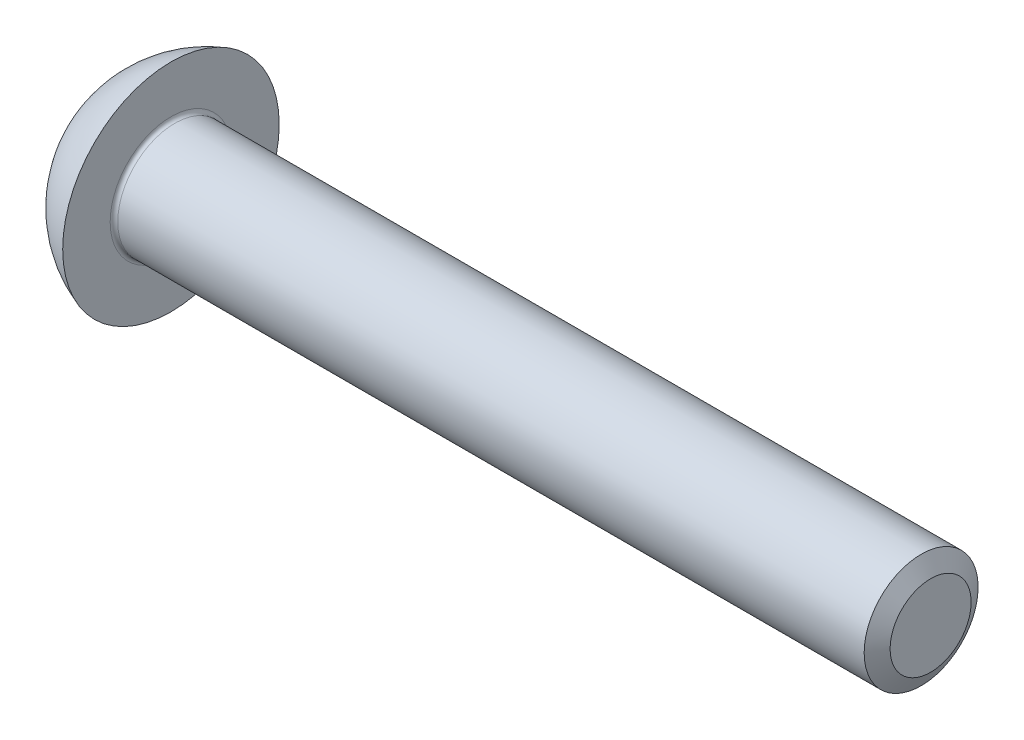
ISO-10303-21;
HEADER;
FILE_DESCRIPTION(('STEP AP214'),'2;1');
FILE_NAME('part.step','',(''),(''),'','','');
FILE_SCHEMA(('AUTOMOTIVE_DESIGN { 1 0 10303 214 1 1 1 1 }'));
ENDSEC;
DATA;
#1=APPLICATION_CONTEXT('core data for automotive mechanical design processes');
#2=APPLICATION_PROTOCOL_DEFINITION('international standard','automotive_design',2000,#1);
#3=PRODUCT_CONTEXT('',#1,'mechanical');
#4=PRODUCT('Part','Part','',(#3));
#5=PRODUCT_RELATED_PRODUCT_CATEGORY('part','',(#4));
#6=PRODUCT_DEFINITION_FORMATION('','',#4);
#7=PRODUCT_DEFINITION_CONTEXT('part definition',#1,'design');
#8=PRODUCT_DEFINITION('design','',#6,#7);
#9=PRODUCT_DEFINITION_SHAPE('','',#8);
#10=(LENGTH_UNIT() NAMED_UNIT(*) SI_UNIT(.MILLI.,.METRE.));
#11=(NAMED_UNIT(*) PLANE_ANGLE_UNIT() SI_UNIT($,.RADIAN.));
#12=(NAMED_UNIT(*) SI_UNIT($,.STERADIAN.) SOLID_ANGLE_UNIT());
#13=UNCERTAINTY_MEASURE_WITH_UNIT(LENGTH_MEASURE(1.E-05),#10,'distance_accuracy_value','');
#14=(GEOMETRIC_REPRESENTATION_CONTEXT(3) GLOBAL_UNCERTAINTY_ASSIGNED_CONTEXT((#13)) GLOBAL_UNIT_ASSIGNED_CONTEXT((#10,
#11,#12)) REPRESENTATION_CONTEXT('',''));
#15=CARTESIAN_POINT('',(0.,0.,0.));
#16=DIRECTION('',(0.,0.,1.));
#17=DIRECTION('',(1.,0.,0.));
#18=AXIS2_PLACEMENT_3D('',#15,#16,#17);
#19=CARTESIAN_POINT('',(-21.65,0.,0.));
#20=DIRECTION('',(-1.,0.,0.));
#21=DIRECTION('',(0.,0.,1.));
#22=AXIS2_PLACEMENT_3D('',#19,#20,#21);
#23=CYLINDRICAL_SURFACE('',#22,1.5);
#24=CARTESIAN_POINT('',(-19.9,0.,0.));
#25=DIRECTION('',(-1.,0.,0.));
#26=DIRECTION('',(0.,0.,1.));
#27=AXIS2_PLACEMENT_3D('',#24,#25,#26);
#28=CIRCLE('',#27,1.5);
#29=CARTESIAN_POINT('',(-19.9,0.,1.5));
#30=VERTEX_POINT('',#29);
#31=EDGE_CURVE('E264',#30,#30,#28,.T.);
#32=ORIENTED_EDGE('',*,*,#31,.F.);
#33=EDGE_LOOP('',(#32));
#34=FACE_BOUND('',#33,.T.);
#35=CARTESIAN_POINT('',(-0.25,0.,0.));
#36=DIRECTION('',(-1.,0.,0.));
#37=DIRECTION('',(0.,0.,1.));
#38=AXIS2_PLACEMENT_3D('',#35,#36,#37);
#39=CIRCLE('',#38,1.5);
#40=CARTESIAN_POINT('',(-0.25,0.,1.5));
#41=VERTEX_POINT('',#40);
#42=EDGE_CURVE('E448',#41,#41,#39,.T.);
#43=ORIENTED_EDGE('',*,*,#42,.T.);
#44=EDGE_LOOP('',(#43));
#45=FACE_BOUND('',#44,.T.);
#46=ADVANCED_FACE('F42',(#34,#45),#23,.T.);
#47=CARTESIAN_POINT('',(-21.65,0.,0.));
#48=DIRECTION('',(1.,0.,0.));
#49=DIRECTION('',(0.,0.,-1.));
#50=AXIS2_PLACEMENT_3D('',#47,#48,#49);
#51=PLANE('',#50);
#52=CARTESIAN_POINT('',(-21.65,0.,0.));
#53=DIRECTION('',(-1.,0.,0.));
#54=DIRECTION('',(0.,0.,1.));
#55=AXIS2_PLACEMENT_3D('',#52,#53,#54);
#56=CIRCLE('',#55,1.5);
#57=CARTESIAN_POINT('',(-21.65,1.5,0.));
#58=VERTEX_POINT('',#57);
#59=EDGE_CURVE('E256',#58,#58,#56,.T.);
#60=ORIENTED_EDGE('',*,*,#59,.T.);
#61=EDGE_LOOP('',(#60));
#62=FACE_BOUND('',#61,.T.);
#63=CARTESIAN_POINT('',(-21.65,0.,0.));
#64=DIRECTION('',(1.,0.,0.));
#65=DIRECTION('',(0.,0.,-1.));
#66=AXIS2_PLACEMENT_3D('',#63,#64,#65);
#67=CIRCLE('',#66,1.15470053837925);
#68=CARTESIAN_POINT('',(-21.65,-0.577350269189627,-1.));
#69=VERTEX_POINT('',#68);
#70=CARTESIAN_POINT('',(-21.65,-1.15470053837925,0.));
#71=VERTEX_POINT('',#70);
#72=EDGE_CURVE('E11',#69,#71,#67,.F.);
#73=ORIENTED_EDGE('',*,*,#72,.F.);
#74=CARTESIAN_POINT('',(-21.65,0.577350269189628,-1.));
#75=VERTEX_POINT('',#74);
#76=EDGE_CURVE('E46',#75,#69,#67,.F.);
#77=ORIENTED_EDGE('',*,*,#76,.F.);
#78=CARTESIAN_POINT('',(-21.65,1.15470053837925,0.));
#79=VERTEX_POINT('',#78);
#80=EDGE_CURVE('E115',#79,#75,#67,.F.);
#81=ORIENTED_EDGE('',*,*,#80,.F.);
#82=CARTESIAN_POINT('',(-21.65,0.,0.));
#83=DIRECTION('',(-1.,0.,0.));
#84=DIRECTION('',(0.,0.,1.));
#85=AXIS2_PLACEMENT_3D('',#82,#83,#84);
#86=CIRCLE('',#85,1.15470053837925);
#87=CARTESIAN_POINT('',(-21.65,0.577350269189629,1.));
#88=VERTEX_POINT('',#87);
#89=EDGE_CURVE('E135',#88,#79,#86,.T.);
#90=ORIENTED_EDGE('',*,*,#89,.F.);
#91=CARTESIAN_POINT('',(-21.65,-0.577350269189633,0.999999999999999));
#92=VERTEX_POINT('',#91);
#93=EDGE_CURVE('E330',#92,#88,#67,.F.);
#94=ORIENTED_EDGE('',*,*,#93,.F.);
#95=EDGE_CURVE('E51',#71,#92,#67,.F.);
#96=ORIENTED_EDGE('',*,*,#95,.F.);
#97=EDGE_LOOP('',(#73,#77,#81,#90,#94,#96));
#98=FACE_BOUND('',#97,.T.);
#99=ADVANCED_FACE('F44',(#62,#98),#51,.F.);
#100=CARTESIAN_POINT('',(-19.0454545454545,0.,0.));
#101=DIRECTION('',(-1.,0.,0.));
#102=DIRECTION('',(0.,1.,0.));
#103=AXIS2_PLACEMENT_3D('',#100,#101,#102);
#104=SPHERICAL_SURFACE('',#103,3.00560426949281);
#105=CARTESIAN_POINT('',(-20.,0.,0.));
#106=DIRECTION('',(-1.,0.,0.));
#107=DIRECTION('',(0.,0.,1.));
#108=AXIS2_PLACEMENT_3D('',#105,#106,#107);
#109=CIRCLE('',#108,2.85);
#110=CARTESIAN_POINT('',(-20.,2.85,0.));
#111=VERTEX_POINT('',#110);
#112=EDGE_CURVE('E259',#111,#111,#109,.T.);
#113=CARTESIAN_POINT('',(-21.65,1.5,0.));
#114=CARTESIAN_POINT('',(-21.6386705331495,1.51967216925548,0.));
#115=CARTESIAN_POINT('',(-21.6271181108235,1.53921593268644,0.));
#116=CARTESIAN_POINT('',(-21.6035734644196,1.57803672196104,0.));
#117=CARTESIAN_POINT('',(-21.5915812403415,1.59731374780469,0.));
#118=CARTESIAN_POINT('',(-21.5671630996322,1.6355911359664,0.));
#119=CARTESIAN_POINT('',(-21.554737183001,1.65459149828447,0.));
#120=CARTESIAN_POINT('',(-21.5294580495481,1.69230581219272,0.));
#121=CARTESIAN_POINT('',(-21.5166048327265,1.7110197637829,0.));
#122=CARTESIAN_POINT('',(-21.4904776944242,1.74815164624667,0.));
#123=CARTESIAN_POINT('',(-21.4772037729434,1.76656957712027,0.));
#124=CARTESIAN_POINT('',(-21.4502420411911,1.80309996277641,0.));
#125=CARTESIAN_POINT('',(-21.4365542309196,1.82121241755895,0.));
#126=CARTESIAN_POINT('',(-21.4087717487848,1.85712255178676,0.));
#127=CARTESIAN_POINT('',(-21.3946770769215,1.87492023123203,0.));
#128=CARTESIAN_POINT('',(-21.366088108,1.91019167733672,0.));
#129=CARTESIAN_POINT('',(-21.3515938109419,1.92766544399614,0.));
#130=CARTESIAN_POINT('',(-21.3222130331156,1.96228009332959,0.));
#131=CARTESIAN_POINT('',(-21.3073265523475,1.97942097600363,0.));
#132=CARTESIAN_POINT('',(-21.2771690499588,2.013361057086,0.));
#133=CARTESIAN_POINT('',(-21.2618980283382,2.03016025549433,0.));
#134=CARTESIAN_POINT('',(-21.2309792845233,2.06340834318511,0.));
#135=CARTESIAN_POINT('',(-21.2153315623289,2.07985723246756,0.));
#136=CARTESIAN_POINT('',(-21.1836674510477,2.11239625689921,0.));
#137=CARTESIAN_POINT('',(-21.1676510619609,2.12848639204841,0.));
#138=CARTESIAN_POINT('',(-21.1352578398529,2.16029964739355,0.));
#139=CARTESIAN_POINT('',(-21.1188810068317,2.17602276758948,0.));
#140=CARTESIAN_POINT('',(-21.0857753048683,2.2070939206369,0.));
#141=CARTESIAN_POINT('',(-21.069046435926,2.22244195348839,0.));
#142=CARTESIAN_POINT('',(-21.0352452508718,2.25275505202893,0.));
#143=CARTESIAN_POINT('',(-21.01817293476,2.26772011771799,0.));
#144=CARTESIAN_POINT('',(-20.9836936204474,2.29725959873447,0.));
#145=CARTESIAN_POINT('',(-20.9662866222466,2.3118340140619,0.));
#146=CARTESIAN_POINT('',(-20.9311468806653,2.34058471171934,0.));
#147=CARTESIAN_POINT('',(-20.9134141372848,2.35476099404935,0.));
#148=CARTESIAN_POINT('',(-20.8776320094939,2.38270814748122,0.));
#149=CARTESIAN_POINT('',(-20.8595826250834,2.39647901858308,0.));
#150=CARTESIAN_POINT('',(-20.8231764819488,2.42360827946968,0.));
#151=CARTESIAN_POINT('',(-20.8048197232246,2.43696666925441,0.));
#152=CARTESIAN_POINT('',(-20.7678082559874,2.46326410918943,0.));
#153=CARTESIAN_POINT('',(-20.7491535474743,2.4762031593397,0.));
#154=CARTESIAN_POINT('',(-20.7115557581542,2.50165527698115,0.));
#155=CARTESIAN_POINT('',(-20.6926126773472,2.51416834447232,0.));
#156=CARTESIAN_POINT('',(-20.6544478689872,2.53876207247436,0.));
#157=CARTESIAN_POINT('',(-20.6352261414343,2.55084273298524,0.));
#158=CARTESIAN_POINT('',(-20.5965139081898,2.57456544470666,0.));
#159=CARTESIAN_POINT('',(-20.5770234024984,2.5862074959172,0.));
#160=CARTESIAN_POINT('',(-20.5377836195783,2.60904701190566,0.));
#161=CARTESIAN_POINT('',(-20.5180343423497,2.62024447668356,0.));
#162=CARTESIAN_POINT('',(-20.4782871558097,2.6421890709225,0.));
#163=CARTESIAN_POINT('',(-20.4582892464984,2.65293620038353,0.));
#164=CARTESIAN_POINT('',(-20.4180550629064,2.67397460633529,0.));
#165=CARTESIAN_POINT('',(-20.3978187886257,2.68426588282604,0.));
#166=CARTESIAN_POINT('',(-20.3571182645539,2.70438729913089,0.));
#167=CARTESIAN_POINT('',(-20.3366540147628,2.714217438945,0.));
#168=CARTESIAN_POINT('',(-20.2955080462974,2.73341153528513,0.));
#169=CARTESIAN_POINT('',(-20.2748263276231,2.74277549181114,0.));
#170=CARTESIAN_POINT('',(-20.2332560392077,2.7610324130256,0.));
#171=CARTESIAN_POINT('',(-20.2123674694665,2.76992537771405,0.));
#172=CARTESIAN_POINT('',(-20.1703942046549,2.78723575329491,0.));
#173=CARTESIAN_POINT('',(-20.1493095095844,2.79565316418733,0.));
#174=CARTESIAN_POINT('',(-20.1069548141172,2.81200809653372,0.));
#175=CARTESIAN_POINT('',(-20.0856848137203,2.8199456179877,0.));
#176=CARTESIAN_POINT('',(-20.0429704467276,2.83533674876495,0.));
#177=CARTESIAN_POINT('',(-20.0215260801317,2.84279035808822,0.));
#178=CARTESIAN_POINT('',(-20.,2.85,0.));
#179=B_SPLINE_CURVE_WITH_KNOTS('',3,(#113,#114,#115,#116,#117,#118,#119,#120,#121,#122,#123,
#124,#125,#126,#127,#128,#129,#130,#131,#132,#133,#134,#135,#136,#137,#138,#139,#140,#141,#142,
#143,#144,#145,#146,#147,#148,#149,#150,#151,#152,#153,#154,#155,#156,#157,#158,#159,#160,#161,
#162,#163,#164,#165,#166,#167,#168,#169,#170,#171,#172,#173,#174,#175,#176,#177,#178),
.UNSPECIFIED.,.F.,.F.,(4,2,2,2,2,2,2,2,2,2,2,2,2,2,2,2,2,2,2,2,2,2,2,2,2,2,2,2,2,2,2,2,4),(0.,
0.0681025747754097,0.13620514955082,0.204307724326229,0.272410299101638,0.340512873877049,
0.408615448652458,0.476718023427868,0.544820598203277,0.612923172978687,0.681025747754097,
0.749128322529505,0.817230897304915,0.885333472080326,0.953436046855734,1.02153862163114,
1.08964119640655,1.15774377118196,1.22584634595737,1.29394892073278,1.36205149550819,
1.4301540702836,1.49825664505901,1.56635921983442,1.63446179460983,1.70256436938524,
1.77066694416065,1.83876951893606,1.90687209371147,1.97497466848688,2.04307724326229,
2.1111798180377,2.17928239281311),.UNSPECIFIED.);
#180=EDGE_CURVE('BSEAM244',#58,#111,#179,.T.);
#181=ORIENTED_EDGE('',*,*,#59,.F.);
#182=ORIENTED_EDGE('',*,*,#112,.T.);
#183=ORIENTED_EDGE('',*,*,#180,.T.);
#184=ORIENTED_EDGE('',*,*,#180,.F.);
#185=EDGE_LOOP('',(#181,#183,#182,#184));
#186=FACE_BOUND('',#185,.T.);
#187=ADVANCED_FACE('F244',(#186),#104,.T.);
#188=CARTESIAN_POINT('',(-20.,1.6,0.));
#189=DIRECTION('',(-1.,0.,0.));
#190=DIRECTION('',(0.,0.,1.));
#191=AXIS2_PLACEMENT_3D('',#188,#189,#190);
#192=PLANE('',#191);
#193=ORIENTED_EDGE('',*,*,#112,.F.);
#194=EDGE_LOOP('',(#193));
#195=FACE_BOUND('',#194,.T.);
#196=CARTESIAN_POINT('',(-20.,0.,0.));
#197=DIRECTION('',(-1.,0.,0.));
#198=DIRECTION('',(0.,0.,1.));
#199=AXIS2_PLACEMENT_3D('',#196,#197,#198);
#200=CIRCLE('',#199,1.6);
#201=CARTESIAN_POINT('',(-20.,0.,1.6));
#202=VERTEX_POINT('',#201);
#203=EDGE_CURVE('E260',#202,#202,#200,.T.);
#204=ORIENTED_EDGE('',*,*,#203,.T.);
#205=EDGE_LOOP('',(#204));
#206=FACE_BOUND('',#205,.T.);
#207=ADVANCED_FACE('F241',(#195,#206),#192,.F.);
#208=CARTESIAN_POINT('',(-19.9,0.,0.));
#209=DIRECTION('',(-1.,0.,0.));
#210=DIRECTION('',(0.,0.,1.));
#211=AXIS2_PLACEMENT_3D('',#208,#209,#210);
#212=TOROIDAL_SURFACE('',#211,1.6,0.100000000000001);
#213=ORIENTED_EDGE('',*,*,#203,.F.);
#214=EDGE_LOOP('',(#213));
#215=FACE_BOUND('',#214,.T.);
#216=ORIENTED_EDGE('',*,*,#31,.T.);
#217=EDGE_LOOP('',(#216));
#218=FACE_BOUND('',#217,.T.);
#219=ADVANCED_FACE('F238',(#215,#218),#212,.F.);
#220=CARTESIAN_POINT('',(-21.35,0.,0.));
#221=DIRECTION('',(-1.,0.,0.));
#222=DIRECTION('',(0.,0.,1.));
#223=AXIS2_PLACEMENT_3D('',#220,#221,#222);
#224=CONICAL_SURFACE('',#223,0.,1.31660847419538);
#225=CARTESIAN_POINT('',(-21.8201338061757,-1.5081300450323,-1.));
#226=CARTESIAN_POINT('',(-21.8103550434582,-1.46296169551438,-1.));
#227=CARTESIAN_POINT('',(-21.8007010634319,-1.41776633015547,-1.));
#228=CARTESIAN_POINT('',(-21.7817057249496,-1.32730802004725,-1.));
#229=CARTESIAN_POINT('',(-21.7723643798043,-1.28204507250605,-1.));
#230=CARTESIAN_POINT('',(-21.744887707109,-1.1460540932135,-1.));
#231=CARTESIAN_POINT('',(-21.727318593487,-1.05520983554783,-1.));
#232=CARTESIAN_POINT('',(-21.6946113120355,-0.873838301527069,-1.));
#233=CARTESIAN_POINT('',(-21.6794545669183,-0.783314439111169,-1.));
#234=CARTESIAN_POINT('',(-21.6526000869216,-0.601754544937858,-1.));
#235=CARTESIAN_POINT('',(-21.6409016960468,-0.510718613654571,-1.));
#236=CARTESIAN_POINT('',(-21.6224688104588,-0.32714728936339,-1.));
#237=CARTESIAN_POINT('',(-21.615787761882,-0.234606191530869,-1.));
#238=CARTESIAN_POINT('',(-21.6090368362792,-0.0493046546038942,-1.));
#239=CARTESIAN_POINT('',(-21.6089640024594,0.04345566782023,-1.));
#240=CARTESIAN_POINT('',(-21.6154534933963,0.229083736297403,-1.));
#241=CARTESIAN_POINT('',(-21.6220414736928,0.321950510989406,-1.));
#242=CARTESIAN_POINT('',(-21.6404572139866,0.507192547661315,-1.));
#243=CARTESIAN_POINT('',(-21.6522884816114,0.59956743864776,-1.));
#244=CARTESIAN_POINT('',(-21.6798118313046,0.785811374344468,-1.));
#245=CARTESIAN_POINT('',(-21.6955836030667,0.879668210998819,-1.));
#246=CARTESIAN_POINT('',(-21.7295232966728,1.06695285350417,-1.));
#247=CARTESIAN_POINT('',(-21.7476915787193,1.16038059267177,-1.));
#248=CARTESIAN_POINT('',(-21.7855853163011,1.34694314919725,-1.));
#249=CARTESIAN_POINT('',(-21.8053112029702,1.44007787798178,-1.));
#250=CARTESIAN_POINT('',(-21.8457971322914,1.62612272763755,-1.));
#251=CARTESIAN_POINT('',(-21.866557196056,1.71903284388273,-1.));
#252=CARTESIAN_POINT('',(-21.9085485742601,1.90363742744431,-1.));
#253=CARTESIAN_POINT('',(-21.9297718689088,1.99533372655925,-1.));
#254=CARTESIAN_POINT('',(-21.9727143057913,2.17861191601366,-1.));
#255=CARTESIAN_POINT('',(-21.9944334585808,2.27019380387373,-1.));
#256=CARTESIAN_POINT('',(-22.0382042420233,2.45314970796373,-1.));
#257=CARTESIAN_POINT('',(-22.0602553943374,2.54452383886908,-1.));
#258=CARTESIAN_POINT('',(-22.1046332471854,2.72720190599483,-1.));
#259=CARTESIAN_POINT('',(-22.1269599382911,2.81850584450411,-1.));
#260=CARTESIAN_POINT('',(-22.1493826695211,2.9097859214388,-1.));
#261=B_SPLINE_CURVE_WITH_KNOTS('',3,(#225,#226,#227,#228,#229,#230,#231,#232,#233,#234,#235,
#236,#237,#238,#239,#240,#241,#242,#243,#244,#245,#246,#247,#248,#249,#250,#251,#252,#253,#254,
#255,#256,#257,#258,#259,#260),.UNSPECIFIED.,.F.,.F.,(4,2,2,2,2,2,2,2,2,2,2,2,2,2,2,2,2,4),(0.,
0.138643869889782,0.277293635233151,0.554857004517541,0.830167022781704,1.10542478551794,
1.38357462934897,1.66160001660695,1.94070037269331,2.21998772241579,2.50545939030144,
2.79097401441239,3.07656794584651,3.36216771000261,3.64452690710852,3.92689212062334,
4.20888343548738,4.49086512790397),.UNSPECIFIED.);
#262=EDGE_CURVE('E106',#69,#75,#261,.T.);
#263=ORIENTED_EDGE('',*,*,#262,.T.);
#264=ORIENTED_EDGE('',*,*,#76,.T.);
#265=EDGE_LOOP('',(#263,#264));
#266=FACE_BOUND('',#265,.T.);
#267=ADVANCED_FACE('F110',(#266),#224,.F.);
#268=CARTESIAN_POINT('',(-21.6500300044995,0.57723479913579,-1.0002));
#269=CARTESIAN_POINT('',(-21.6437929192042,0.601225021738601,-0.958647715567044));
#270=CARTESIAN_POINT('',(-21.6381313786167,0.625256195021443,-0.917024502475672));
#271=CARTESIAN_POINT('',(-21.6281854217223,0.673398386330441,-0.833639781140785));
#272=CARTESIAN_POINT('',(-21.6239015302713,0.697509431260086,-0.791878226299065));
#273=CARTESIAN_POINT('',(-21.6169589031667,0.745673772514857,-0.708455140132715));
#274=CARTESIAN_POINT('',(-21.6142923745456,0.769726780462719,-0.66679410829216));
#275=CARTESIAN_POINT('',(-21.6107168929941,0.817861664223351,-0.583422044002323));
#276=CARTESIAN_POINT('',(-21.6098076211353,0.841943534003896,-0.541711022001162));
#277=CARTESIAN_POINT('',(-21.6098076211353,0.890107273564986,-0.458288977998839));
#278=CARTESIAN_POINT('',(-21.6107168929941,0.914189143345531,-0.416577955997678));
#279=CARTESIAN_POINT('',(-21.6142923745456,0.962324027106163,-0.333205891707841));
#280=CARTESIAN_POINT('',(-21.6169589031667,0.986377035054025,-0.291544859867286));
#281=CARTESIAN_POINT('',(-21.6239015302713,1.0345413763088,-0.208121773700937));
#282=CARTESIAN_POINT('',(-21.6281854217223,1.05865242123844,-0.166360218859217));
#283=CARTESIAN_POINT('',(-21.6381313786167,1.10679461254744,-0.0829754975243298));
#284=CARTESIAN_POINT('',(-21.6437929192042,1.13082578583028,-0.041352284432957));
#285=CARTESIAN_POINT('',(-21.6500300044996,1.15481600843309,0.000199999999998983));
#286=B_SPLINE_CURVE_WITH_KNOTS('',3,(#268,#269,#270,#271,#272,#273,#274,#275,#276,#277,#278,
#279,#280,#281,#282,#283,#284,#285),.UNSPECIFIED.,.F.,.F.,(4,2,2,2,2,2,2,2,4),(0.,
0.145159524820138,0.290374287087485,0.434883682122849,0.57936684736763,0.723850012612412,
0.868359407647777,1.01357416991512,1.15873369473526),.UNSPECIFIED.);
#287=EDGE_CURVE('E133',#75,#79,#286,.T.);
#288=ORIENTED_EDGE('',*,*,#287,.T.);
#289=ORIENTED_EDGE('',*,*,#80,.T.);
#290=EDGE_LOOP('',(#288,#289));
#291=FACE_BOUND('',#290,.T.);
#292=ADVANCED_FACE('F162',(#291),#224,.F.);
#293=CARTESIAN_POINT('',(-21.6500300044996,1.15481600843309,-0.000200000000000797));
#294=CARTESIAN_POINT('',(-21.6437929192042,1.13082578583028,0.0413522844329553));
#295=CARTESIAN_POINT('',(-21.6381313786167,1.10679461254744,0.0829754975243281));
#296=CARTESIAN_POINT('',(-21.6281854217223,1.05865242123844,0.166360218859215));
#297=CARTESIAN_POINT('',(-21.6239015302713,1.0345413763088,0.208121773700935));
#298=CARTESIAN_POINT('',(-21.6169589031667,0.986377035054025,0.291544859867285));
#299=CARTESIAN_POINT('',(-21.6142923745456,0.962324027106163,0.33320589170784));
#300=CARTESIAN_POINT('',(-21.6107168929941,0.914189143345531,0.416577955997676));
#301=CARTESIAN_POINT('',(-21.6098076211353,0.890107273564986,0.458288977998838));
#302=CARTESIAN_POINT('',(-21.6098076211353,0.841943534003896,0.541711022001161));
#303=CARTESIAN_POINT('',(-21.6107168929941,0.817861664223351,0.583422044002322));
#304=CARTESIAN_POINT('',(-21.6142923745456,0.769726780462719,0.666794108292158));
#305=CARTESIAN_POINT('',(-21.6169589031667,0.745673772514857,0.708455140132713));
#306=CARTESIAN_POINT('',(-21.6239015302713,0.697509431260086,0.791878226299063));
#307=CARTESIAN_POINT('',(-21.6281854217223,0.673398386330441,0.833639781140783));
#308=CARTESIAN_POINT('',(-21.6381313786167,0.625256195021443,0.91702450247567));
#309=CARTESIAN_POINT('',(-21.6437929192042,0.601225021738601,0.958647715567043));
#310=CARTESIAN_POINT('',(-21.6500300044995,0.57723479913579,1.0002));
#311=B_SPLINE_CURVE_WITH_KNOTS('',3,(#293,#294,#295,#296,#297,#298,#299,#300,#301,#302,#303,
#304,#305,#306,#307,#308,#309,#310),.UNSPECIFIED.,.F.,.F.,(4,2,2,2,2,2,2,2,4),(0.,
0.145159524820138,0.290374287087485,0.43488368212285,0.579366847367631,0.723850012612412,
0.868359407647777,1.01357416991512,1.15873369473526),.UNSPECIFIED.);
#312=EDGE_CURVE('E184',#79,#88,#311,.T.);
#313=ORIENTED_EDGE('',*,*,#312,.T.);
#314=ORIENTED_EDGE('',*,*,#89,.T.);
#315=EDGE_LOOP('',(#313,#314));
#316=FACE_BOUND('',#315,.T.);
#317=ADVANCED_FACE('F156',(#316),#224,.F.);
#318=CARTESIAN_POINT('',(-21.8201338061757,-1.5081300450323,0.999999999999999));
#319=CARTESIAN_POINT('',(-21.8103550434582,-1.46296169551438,0.999999999999999));
#320=CARTESIAN_POINT('',(-21.8007010634319,-1.41776633015547,0.999999999999999));
#321=CARTESIAN_POINT('',(-21.7817057249496,-1.32730802004725,0.999999999999999));
#322=CARTESIAN_POINT('',(-21.7723643798043,-1.28204507250605,0.999999999999999));
#323=CARTESIAN_POINT('',(-21.744887707109,-1.1460540932135,0.999999999999999));
#324=CARTESIAN_POINT('',(-21.727318593487,-1.05520983554783,0.999999999999999));
#325=CARTESIAN_POINT('',(-21.6946113120355,-0.873838301527069,0.999999999999999));
#326=CARTESIAN_POINT('',(-21.6794545669183,-0.78331443911117,0.999999999999999));
#327=CARTESIAN_POINT('',(-21.6526000869216,-0.601754544937859,0.999999999999999));
#328=CARTESIAN_POINT('',(-21.6409016960468,-0.510718613654572,0.999999999999999));
#329=CARTESIAN_POINT('',(-21.6224688104588,-0.327147289363391,0.999999999999999));
#330=CARTESIAN_POINT('',(-21.615787761882,-0.23460619153087,0.999999999999999));
#331=CARTESIAN_POINT('',(-21.6090368362792,-0.0493046546038947,0.999999999999999));
#332=CARTESIAN_POINT('',(-21.6089640024594,0.0434556678202297,0.999999999999999));
#333=CARTESIAN_POINT('',(-21.6154534933963,0.229083736297403,0.999999999999999));
#334=CARTESIAN_POINT('',(-21.6220414736928,0.321950510989406,0.999999999999999));
#335=CARTESIAN_POINT('',(-21.6404572139866,0.507192547661315,0.999999999999999));
#336=CARTESIAN_POINT('',(-21.6522884816114,0.59956743864776,0.999999999999999));
#337=CARTESIAN_POINT('',(-21.6798118313046,0.785811374344468,0.999999999999999));
#338=CARTESIAN_POINT('',(-21.6955836030667,0.87966821099882,0.999999999999999));
#339=CARTESIAN_POINT('',(-21.7295232966728,1.06695285350417,0.999999999999999));
#340=CARTESIAN_POINT('',(-21.7476915787193,1.16038059267177,0.999999999999999));
#341=CARTESIAN_POINT('',(-21.7855853163011,1.34694314919725,0.999999999999999));
#342=CARTESIAN_POINT('',(-21.8053112029702,1.44007787798179,0.999999999999999));
#343=CARTESIAN_POINT('',(-21.8457971322914,1.62612272763755,0.999999999999999));
#344=CARTESIAN_POINT('',(-21.866557196056,1.71903284388273,0.999999999999999));
#345=CARTESIAN_POINT('',(-21.9085485742601,1.90363742744431,0.999999999999999));
#346=CARTESIAN_POINT('',(-21.9297718689088,1.99533372655925,0.999999999999999));
#347=CARTESIAN_POINT('',(-21.9727143057913,2.17861191601366,0.999999999999999));
#348=CARTESIAN_POINT('',(-21.9944334585808,2.27019380387373,0.999999999999999));
#349=CARTESIAN_POINT('',(-22.0382042420233,2.45314970796373,0.999999999999999));
#350=CARTESIAN_POINT('',(-22.0602553943374,2.54452383886908,0.999999999999999));
#351=CARTESIAN_POINT('',(-22.1046332471854,2.72720190599484,0.999999999999999));
#352=CARTESIAN_POINT('',(-22.1269599382911,2.81850584450411,0.999999999999999));
#353=CARTESIAN_POINT('',(-22.1493826695211,2.9097859214388,0.999999999999999));
#354=B_SPLINE_CURVE_WITH_KNOTS('',3,(#318,#319,#320,#321,#322,#323,#324,#325,#326,#327,#328,
#329,#330,#331,#332,#333,#334,#335,#336,#337,#338,#339,#340,#341,#342,#343,#344,#345,#346,#347,
#348,#349,#350,#351,#352,#353),.UNSPECIFIED.,.F.,.F.,(4,2,2,2,2,2,2,2,2,2,2,2,2,2,2,2,2,4),(0.,
0.138643869889783,0.277293635233152,0.554857004517541,0.830167022781703,1.10542478551794,
1.38357462934897,1.66160001660695,1.94070037269331,2.21998772241579,2.50545939030144,
2.79097401441239,3.07656794584652,3.36216771000261,3.64452690710852,3.92689212062334,
4.20888343548738,4.49086512790397),.UNSPECIFIED.);
#355=EDGE_CURVE('E63',#88,#92,#354,.F.);
#356=ORIENTED_EDGE('',*,*,#355,.T.);
#357=ORIENTED_EDGE('',*,*,#93,.T.);
#358=EDGE_LOOP('',(#356,#357));
#359=FACE_BOUND('',#358,.T.);
#360=ADVANCED_FACE('F161',(#359),#224,.F.);
#361=CARTESIAN_POINT('',(-21.6500300044995,-0.577234799135789,1.0002));
#362=CARTESIAN_POINT('',(-21.6437929192042,-0.6012250217386,0.958647715567043));
#363=CARTESIAN_POINT('',(-21.6381313786167,-0.625256195021441,0.91702450247567));
#364=CARTESIAN_POINT('',(-21.6281854217223,-0.67339838633044,0.833639781140783));
#365=CARTESIAN_POINT('',(-21.6239015302713,-0.697509431260085,0.791878226299063));
#366=CARTESIAN_POINT('',(-21.6169589031667,-0.745673772514856,0.708455140132713));
#367=CARTESIAN_POINT('',(-21.6142923745456,-0.769726780462718,0.666794108292158));
#368=CARTESIAN_POINT('',(-21.6107168929941,-0.81786166422335,0.583422044002322));
#369=CARTESIAN_POINT('',(-21.6098076211353,-0.841943534003895,0.54171102200116));
#370=CARTESIAN_POINT('',(-21.6098076211353,-0.890107273564985,0.458288977998838));
#371=CARTESIAN_POINT('',(-21.6107168929941,-0.91418914334553,0.416577955997676));
#372=CARTESIAN_POINT('',(-21.6142923745456,-0.962324027106161,0.33320589170784));
#373=CARTESIAN_POINT('',(-21.6169589031667,-0.986377035054023,0.291544859867285));
#374=CARTESIAN_POINT('',(-21.6239015302713,-1.03454137630879,0.208121773700935));
#375=CARTESIAN_POINT('',(-21.6281854217223,-1.05865242123844,0.166360218859215));
#376=CARTESIAN_POINT('',(-21.6381313786167,-1.10679461254744,0.0829754975243279));
#377=CARTESIAN_POINT('',(-21.6437929192042,-1.13082578583028,0.0413522844329551));
#378=CARTESIAN_POINT('',(-21.6500300044995,-1.15481600843309,-0.000200000000000986));
#379=B_SPLINE_CURVE_WITH_KNOTS('',3,(#361,#362,#363,#364,#365,#366,#367,#368,#369,#370,#371,
#372,#373,#374,#375,#376,#377,#378),.UNSPECIFIED.,.F.,.F.,(4,2,2,2,2,2,2,2,4),(0.,
0.145159524820138,0.290374287087485,0.434883682122849,0.57936684736763,0.723850012612412,
0.868359407647776,1.01357416991512,1.15873369473526),.UNSPECIFIED.);
#380=EDGE_CURVE('E57',#92,#71,#379,.T.);
#381=ORIENTED_EDGE('',*,*,#380,.T.);
#382=ORIENTED_EDGE('',*,*,#95,.T.);
#383=EDGE_LOOP('',(#381,#382));
#384=FACE_BOUND('',#383,.T.);
#385=ADVANCED_FACE('F316',(#384),#224,.F.);
#386=CARTESIAN_POINT('',(-21.6500300044995,-1.15481600843309,0.0001999999999991));
#387=CARTESIAN_POINT('',(-21.6437929192042,-1.13082578583028,-0.0413522844329572));
#388=CARTESIAN_POINT('',(-21.6381313786167,-1.10679461254744,-0.08297549752433));
#389=CARTESIAN_POINT('',(-21.6281854217223,-1.05865242123844,-0.166360218859217));
#390=CARTESIAN_POINT('',(-21.6239015302713,-1.03454137630879,-0.208121773700937));
#391=CARTESIAN_POINT('',(-21.6169589031667,-0.986377035054023,-0.291544859867287));
#392=CARTESIAN_POINT('',(-21.6142923745456,-0.962324027106161,-0.333205891707842));
#393=CARTESIAN_POINT('',(-21.6107168929941,-0.914189143345529,-0.416577955997678));
#394=CARTESIAN_POINT('',(-21.6098076211353,-0.890107273564984,-0.45828897799884));
#395=CARTESIAN_POINT('',(-21.6098076211353,-0.841943534003894,-0.541711022001162));
#396=CARTESIAN_POINT('',(-21.6107168929941,-0.817861664223349,-0.583422044002324));
#397=CARTESIAN_POINT('',(-21.6142923745456,-0.769726780462717,-0.66679410829216));
#398=CARTESIAN_POINT('',(-21.6169589031667,-0.745673772514855,-0.708455140132715));
#399=CARTESIAN_POINT('',(-21.6239015302713,-0.697509431260084,-0.791878226299065));
#400=CARTESIAN_POINT('',(-21.6281854217223,-0.67339838633044,-0.833639781140785));
#401=CARTESIAN_POINT('',(-21.6381313786167,-0.625256195021441,-0.917024502475672));
#402=CARTESIAN_POINT('',(-21.6437929192042,-0.601225021738599,-0.958647715567045));
#403=CARTESIAN_POINT('',(-21.6500300044995,-0.577234799135788,-1.0002));
#404=B_SPLINE_CURVE_WITH_KNOTS('',3,(#386,#387,#388,#389,#390,#391,#392,#393,#394,#395,#396,
#397,#398,#399,#400,#401,#402,#403),.UNSPECIFIED.,.F.,.F.,(4,2,2,2,2,2,2,2,4),(0.,
0.145159524820138,0.290374287087485,0.43488368212285,0.579366847367631,0.723850012612412,
0.868359407647777,1.01357416991512,1.15873369473526),.UNSPECIFIED.);
#405=EDGE_CURVE('E98',#71,#69,#404,.T.);
#406=ORIENTED_EDGE('',*,*,#405,.T.);
#407=ORIENTED_EDGE('',*,*,#72,.T.);
#408=EDGE_LOOP('',(#406,#407));
#409=FACE_BOUND('',#408,.T.);
#410=ADVANCED_FACE('F100',(#409),#224,.F.);
#411=CARTESIAN_POINT('',(-20.61,0.,0.));
#412=DIRECTION('',(-1.,0.,0.));
#413=DIRECTION('',(0.,0.,1.));
#414=AXIS2_PLACEMENT_3D('',#411,#412,#413);
#415=CONICAL_SURFACE('',#414,1.15470053837925,1.08478502970568);
#416=CARTESIAN_POINT('',(-20.,0.,0.));
#417=VERTEX_POINT('',#416);
#418=VERTEX_LOOP('',#417);
#419=FACE_BOUND('',#418,.T.);
#420=CARTESIAN_POINT('',(-20.9533777683403,-1.50230992873525,0.999999999999999));
#421=CARTESIAN_POINT('',(-20.9340444769777,-1.45833854185076,0.999999999999999));
#422=CARTESIAN_POINT('',(-20.9149232467738,-1.41427434344668,0.999999999999999));
#423=CARTESIAN_POINT('',(-20.8772163059513,-1.32590919920825,0.999999999999999));
#424=CARTESIAN_POINT('',(-20.8586306830292,-1.28160821599644,0.999999999999999));
#425=CARTESIAN_POINT('',(-20.8036681478386,-1.14784319726152,0.999999999999999));
#426=CARTESIAN_POINT('',(-20.7682844804861,-1.05796321251933,0.999999999999999));
#427=CARTESIAN_POINT('',(-20.7014887265583,-0.876123438160721,0.999999999999999));
#428=CARTESIAN_POINT('',(-20.670100993813,-0.78415457894225,0.999999999999999));
#429=CARTESIAN_POINT('',(-20.6142698926597,-0.598229842457832,0.999999999999999));
#430=CARTESIAN_POINT('',(-20.5898112637181,-0.504278829186387,0.999999999999999));
#431=CARTESIAN_POINT('',(-20.561284211292,-0.361662527207036,0.999999999999999));
#432=CARTESIAN_POINT('',(-20.5531336537351,-0.313821896859327,0.999999999999999));
#433=CARTESIAN_POINT('',(-20.5400901383612,-0.217683951682428,0.999999999999999));
#434=CARTESIAN_POINT('',(-20.5351973854909,-0.16938660831547,0.999999999999999));
#435=CARTESIAN_POINT('',(-20.5290689217004,-0.0727543492205689,0.999999999999999));
#436=CARTESIAN_POINT('',(-20.5278181907857,-0.0244204124532986,0.999999999999999));
#437=CARTESIAN_POINT('',(-20.5290340461929,0.0721832270827304,0.999999999999999));
#438=CARTESIAN_POINT('',(-20.5314996115354,0.120452943848543,0.999999999999999));
#439=CARTESIAN_POINT('',(-20.5426858199704,0.247728096968899,0.999999999999999));
#440=CARTESIAN_POINT('',(-20.554415626327,0.32647281707577,0.999999999999999));
#441=CARTESIAN_POINT('',(-20.5853155073204,0.482611029430833,0.999999999999999));
#442=CARTESIAN_POINT('',(-20.6045054158237,0.560000340052675,0.999999999999999));
#443=CARTESIAN_POINT('',(-20.6484420949321,0.714868516061646,0.999999999999999));
#444=CARTESIAN_POINT('',(-20.6732951431871,0.792316418029709,0.999999999999999));
#445=CARTESIAN_POINT('',(-20.7131493499715,0.907307575681682,0.999999999999999));
#446=CARTESIAN_POINT('',(-20.7268173023165,0.945326191835167,0.999999999999999));
#447=CARTESIAN_POINT('',(-20.7548765004687,1.02108213718649,0.999999999999999));
#448=CARTESIAN_POINT('',(-20.7692675113704,1.05881955322302,0.999999999999999));
#449=CARTESIAN_POINT('',(-20.783948942311,1.0964438770373,0.999999999999999));
#450=B_SPLINE_CURVE_WITH_KNOTS('',3,(#420,#421,#422,#423,#424,#425,#426,#427,#428,#429,#430,
#431,#432,#433,#434,#435,#436,#437,#438,#439,#440,#441,#442,#443,#444,#445,#446,#447,#448,#449),
.UNSPECIFIED.,.F.,.F.,(4,2,2,2,2,2,2,2,2,2,2,2,2,2,4),(0.,0.144099688332552,0.288222837954157,
0.577934102924423,0.86933417721438,1.16008739746132,1.30558498590577,1.45109172666275,
1.59599752995897,1.74086353048645,1.97918576956973,2.21814600788026,2.46202630637785,
2.58322416173437,2.70438289404451),.UNSPECIFIED.);
#451=CARTESIAN_POINT('',(-20.61,-0.577350269189627,0.999999999999999));
#452=VERTEX_POINT('',#451);
#453=CARTESIAN_POINT('',(-20.61,0.577350269189628,0.999999999999999));
#454=VERTEX_POINT('',#453);
#455=EDGE_CURVE('E200',#452,#454,#450,.T.);
#456=ORIENTED_EDGE('',*,*,#455,.T.);
#457=CARTESIAN_POINT('',(-20.6100610091491,0.57723479913579,1.0002));
#458=CARTESIAN_POINT('',(-20.5967471675624,0.602421402936659,0.956575522546786));
#459=CARTESIAN_POINT('',(-20.5846484366666,0.627789970277027,0.912635874998038));
#460=CARTESIAN_POINT('',(-20.5635159299897,0.678892423428092,0.824123829748984));
#461=CARTESIAN_POINT('',(-20.5544881451853,0.704626922430508,0.77955036996947));
#462=CARTESIAN_POINT('',(-20.5403368995943,0.755829480104159,0.690864938601231));
#463=CARTESIAN_POINT('',(-20.5351365451759,0.78129204013318,0.646762490940193));
#464=CARTESIAN_POINT('',(-20.5287989102245,0.832321934515702,0.558376121164792));
#465=CARTESIAN_POINT('',(-20.527657647587,0.857889141534312,0.514092419600928));
#466=CARTESIAN_POINT('',(-20.5294293203474,0.906140287040708,0.430518984060451));
#467=CARTESIAN_POINT('',(-20.5319054116845,0.928828599718462,0.391221673764572));
#468=CARTESIAN_POINT('',(-20.5399567288674,0.974082594298357,0.312839455906747));
#469=CARTESIAN_POINT('',(-20.5455343304689,0.996648168786446,0.273754734391397));
#470=CARTESIAN_POINT('',(-20.5595556697914,1.04198502975731,0.195228987734173));
#471=CARTESIAN_POINT('',(-20.5680513970794,1.06475218926301,0.155795110726277));
#472=CARTESIAN_POINT('',(-20.5874031221558,1.1099976059254,0.0774277502573925));
#473=CARTESIAN_POINT('',(-20.5982552609432,1.13247627253034,0.0384935576112354));
#474=CARTESIAN_POINT('',(-20.6100610091491,1.15481600843309,-0.000200000000000459));
#475=B_SPLINE_CURVE_WITH_KNOTS('',3,(#457,#458,#459,#460,#461,#462,#463,#464,#465,#466,#467,
#468,#469,#470,#471,#472,#473,#474),.UNSPECIFIED.,.F.,.F.,(4,2,2,2,2,2,2,2,4),(0.,
0.156356652206858,0.313016607627113,0.466436255933325,0.619705352863253,0.755925705289371,
0.892250546480127,1.03114227500706,1.16980823889878),.UNSPECIFIED.);
#476=CARTESIAN_POINT('',(-20.61,1.15470053837925,0.));
#477=VERTEX_POINT('',#476);
#478=EDGE_CURVE('E208',#454,#477,#475,.T.);
#479=ORIENTED_EDGE('',*,*,#478,.T.);
#480=CARTESIAN_POINT('',(-20.6100610091491,1.15481600843309,0.000199999999998803));
#481=CARTESIAN_POINT('',(-20.5967471675624,1.12962940463222,-0.0434244774532139));
#482=CARTESIAN_POINT('',(-20.5846484366666,1.10426083729186,-0.0873641250019628));
#483=CARTESIAN_POINT('',(-20.5635159299897,1.05315838414079,-0.175876170251017));
#484=CARTESIAN_POINT('',(-20.5544881451853,1.02742388513837,-0.220449630030531));
#485=CARTESIAN_POINT('',(-20.5403368995943,0.976221327464723,-0.30913506139877));
#486=CARTESIAN_POINT('',(-20.5351365451759,0.950758767435702,-0.353237509059808));
#487=CARTESIAN_POINT('',(-20.5287989102245,0.89972887305318,-0.441623878835208));
#488=CARTESIAN_POINT('',(-20.527657647587,0.87416166603457,-0.485907580399072));
#489=CARTESIAN_POINT('',(-20.5294293203474,0.825910520528174,-0.56948101593955));
#490=CARTESIAN_POINT('',(-20.5319054116845,0.80322220785042,-0.608778326235428));
#491=CARTESIAN_POINT('',(-20.5399567288674,0.757968213270525,-0.687160544093253));
#492=CARTESIAN_POINT('',(-20.5455343304689,0.735402638782436,-0.726245265608604));
#493=CARTESIAN_POINT('',(-20.5595556697914,0.690065777811571,-0.804771012265827));
#494=CARTESIAN_POINT('',(-20.5680513970794,0.667298618305872,-0.844204889273724));
#495=CARTESIAN_POINT('',(-20.5874031221558,0.622053201643481,-0.922572249742608));
#496=CARTESIAN_POINT('',(-20.5982552609432,0.599574535038541,-0.961506442388765));
#497=CARTESIAN_POINT('',(-20.6100610091491,0.57723479913579,-1.0002));
#498=B_SPLINE_CURVE_WITH_KNOTS('',3,(#480,#481,#482,#483,#484,#485,#486,#487,#488,#489,#490,
#491,#492,#493,#494,#495,#496,#497),.UNSPECIFIED.,.F.,.F.,(4,2,2,2,2,2,2,2,4),(0.,
0.156356652206859,0.313016607627112,0.466436255933325,0.619705352863253,0.755925705289371,
0.892250546480127,1.03114227500706,1.16980823889878),.UNSPECIFIED.);
#499=CARTESIAN_POINT('',(-20.61,0.577350269189628,-1.));
#500=VERTEX_POINT('',#499);
#501=EDGE_CURVE('E116',#477,#500,#498,.T.);
#502=ORIENTED_EDGE('',*,*,#501,.T.);
#503=CARTESIAN_POINT('',(-20.9533777683403,-1.50230992873526,-1.));
#504=CARTESIAN_POINT('',(-20.9340444769777,-1.45833854185077,-1.));
#505=CARTESIAN_POINT('',(-20.9149232467738,-1.41427434344668,-1.));
#506=CARTESIAN_POINT('',(-20.8772163059513,-1.32590919920826,-1.));
#507=CARTESIAN_POINT('',(-20.8586306830292,-1.28160821599644,-1.));
#508=CARTESIAN_POINT('',(-20.8036681478386,-1.14784319726152,-1.));
#509=CARTESIAN_POINT('',(-20.7682844804861,-1.05796321251933,-1.));
#510=CARTESIAN_POINT('',(-20.7014887265583,-0.876123438160723,-1.));
#511=CARTESIAN_POINT('',(-20.670100993813,-0.784154578942252,-1.));
#512=CARTESIAN_POINT('',(-20.6142698926597,-0.598229842457833,-1.));
#513=CARTESIAN_POINT('',(-20.5898112637181,-0.504278829186389,-1.));
#514=CARTESIAN_POINT('',(-20.561284211292,-0.361662527207036,-1.));
#515=CARTESIAN_POINT('',(-20.5531336537352,-0.313821896859327,-1.));
#516=CARTESIAN_POINT('',(-20.5400901383612,-0.217683951682428,-1.));
#517=CARTESIAN_POINT('',(-20.5351973854909,-0.169386608315468,-1.));
#518=CARTESIAN_POINT('',(-20.5290689217004,-0.0727543492205665,-1.));
#519=CARTESIAN_POINT('',(-20.5278181907857,-0.0244204124532959,-1.));
#520=CARTESIAN_POINT('',(-20.5290340461929,0.072183227082734,-1.));
#521=CARTESIAN_POINT('',(-20.5314996115354,0.120452943848547,-1.));
#522=CARTESIAN_POINT('',(-20.5426858199704,0.247728096968904,-1.));
#523=CARTESIAN_POINT('',(-20.554415626327,0.326472817075775,-1.));
#524=CARTESIAN_POINT('',(-20.5853155073205,0.482611029430839,-1.));
#525=CARTESIAN_POINT('',(-20.6045054158237,0.560000340052681,-1.));
#526=CARTESIAN_POINT('',(-20.6484420949321,0.714868516061654,-1.));
#527=CARTESIAN_POINT('',(-20.6732951431871,0.792316418029718,-1.));
#528=CARTESIAN_POINT('',(-20.7131493499715,0.907307575681692,-1.));
#529=CARTESIAN_POINT('',(-20.7268173023165,0.945326191835176,-1.));
#530=CARTESIAN_POINT('',(-20.7548765004687,1.0210821371865,-1.));
#531=CARTESIAN_POINT('',(-20.7692675113704,1.05881955322303,-1.));
#532=CARTESIAN_POINT('',(-20.783948942311,1.09644387703731,-1.));
#533=B_SPLINE_CURVE_WITH_KNOTS('',3,(#503,#504,#505,#506,#507,#508,#509,#510,#511,#512,#513,
#514,#515,#516,#517,#518,#519,#520,#521,#522,#523,#524,#525,#526,#527,#528,#529,#530,#531,#532),
.UNSPECIFIED.,.F.,.F.,(4,2,2,2,2,2,2,2,2,2,2,2,2,2,4),(0.,0.144099688332552,0.28822283795416,
0.577934102924429,0.869334177214384,1.16008739746132,1.30558498590577,1.45109172666276,
1.59599752995898,1.74086353048646,1.97918576956974,2.21814600788028,2.46202630637787,
2.58322416173438,2.70438289404453),.UNSPECIFIED.);
#534=CARTESIAN_POINT('',(-20.61,-0.577350269189626,-1.));
#535=VERTEX_POINT('',#534);
#536=EDGE_CURVE('E273',#500,#535,#533,.F.);
#537=ORIENTED_EDGE('',*,*,#536,.T.);
#538=CARTESIAN_POINT('',(-20.6100610091491,-0.577234799135788,-1.0002));
#539=CARTESIAN_POINT('',(-20.5967471675624,-0.602421402936658,-0.956575522546788));
#540=CARTESIAN_POINT('',(-20.5846484366666,-0.627789970277025,-0.912635874998039));
#541=CARTESIAN_POINT('',(-20.5635159299897,-0.678892423428091,-0.824123829748985));
#542=CARTESIAN_POINT('',(-20.5544881451853,-0.704626922430506,-0.779550369969472));
#543=CARTESIAN_POINT('',(-20.5403368995943,-0.755829480104157,-0.690864938601233));
#544=CARTESIAN_POINT('',(-20.5351365451759,-0.781292040133178,-0.646762490940195));
#545=CARTESIAN_POINT('',(-20.5287989102245,-0.8323219345157,-0.558376121164794));
#546=CARTESIAN_POINT('',(-20.527657647587,-0.85788914153431,-0.51409241960093));
#547=CARTESIAN_POINT('',(-20.5294293203474,-0.906140287040706,-0.430518984060453));
#548=CARTESIAN_POINT('',(-20.5319054116845,-0.92882859971846,-0.391221673764574));
#549=CARTESIAN_POINT('',(-20.5399567288674,-0.974082594298355,-0.312839455906749));
#550=CARTESIAN_POINT('',(-20.5455343304689,-0.996648168786445,-0.273754734391398));
#551=CARTESIAN_POINT('',(-20.5595556697914,-1.04198502975731,-0.195228987734175));
#552=CARTESIAN_POINT('',(-20.5680513970794,-1.06475218926301,-0.155795110726278));
#553=CARTESIAN_POINT('',(-20.5874031221558,-1.1099976059254,-0.0774277502573936));
#554=CARTESIAN_POINT('',(-20.5982552609432,-1.13247627253034,-0.0384935576112364));
#555=CARTESIAN_POINT('',(-20.6100610091491,-1.15481600843309,0.000199999999998944));
#556=B_SPLINE_CURVE_WITH_KNOTS('',3,(#538,#539,#540,#541,#542,#543,#544,#545,#546,#547,#548,
#549,#550,#551,#552,#553,#554,#555),.UNSPECIFIED.,.F.,.F.,(4,2,2,2,2,2,2,2,4),(0.,
0.156356652206858,0.313016607627112,0.466436255933324,0.619705352863253,0.755925705289371,
0.892250546480127,1.03114227500706,1.16980823889878),.UNSPECIFIED.);
#557=CARTESIAN_POINT('',(-20.61,-1.15470053837925,0.));
#558=VERTEX_POINT('',#557);
#559=EDGE_CURVE('E123',#535,#558,#556,.T.);
#560=ORIENTED_EDGE('',*,*,#559,.T.);
#561=CARTESIAN_POINT('',(-20.6100610091491,-1.15481600843309,-0.000200000000000695));
#562=CARTESIAN_POINT('',(-20.5967471675624,-1.12962940463222,0.043424477453212));
#563=CARTESIAN_POINT('',(-20.5846484366666,-1.10426083729185,0.0873641250019605));
#564=CARTESIAN_POINT('',(-20.5635159299897,-1.05315838414079,0.175876170251014));
#565=CARTESIAN_POINT('',(-20.5544881451853,-1.02742388513837,0.220449630030528));
#566=CARTESIAN_POINT('',(-20.5403368995943,-0.976221327464722,0.309135061398767));
#567=CARTESIAN_POINT('',(-20.5351365451759,-0.950758767435701,0.353237509059805));
#568=CARTESIAN_POINT('',(-20.5287989102245,-0.899728873053179,0.441623878835206));
#569=CARTESIAN_POINT('',(-20.527657647587,-0.874161666034569,0.485907580399069));
#570=CARTESIAN_POINT('',(-20.5294293203474,-0.825910520528173,0.569481015939547));
#571=CARTESIAN_POINT('',(-20.5319054116845,-0.803222207850419,0.608778326235426));
#572=CARTESIAN_POINT('',(-20.5399567288674,-0.757968213270524,0.687160544093251));
#573=CARTESIAN_POINT('',(-20.5455343304689,-0.735402638782435,0.726245265608602));
#574=CARTESIAN_POINT('',(-20.5595556697914,-0.69006577781157,0.804771012265825));
#575=CARTESIAN_POINT('',(-20.5680513970794,-0.66729861830587,0.844204889273722));
#576=CARTESIAN_POINT('',(-20.5874031221558,-0.622053201643479,0.922572249742606));
#577=CARTESIAN_POINT('',(-20.5982552609432,-0.59957453503854,0.961506442388764));
#578=CARTESIAN_POINT('',(-20.6100610091491,-0.577234799135789,1.0002));
#579=B_SPLINE_CURVE_WITH_KNOTS('',3,(#561,#562,#563,#564,#565,#566,#567,#568,#569,#570,#571,
#572,#573,#574,#575,#576,#577,#578),.UNSPECIFIED.,.F.,.F.,(4,2,2,2,2,2,2,2,4),(0.,
0.156356652206858,0.313016607627112,0.466436255933324,0.619705352863253,0.755925705289371,
0.892250546480127,1.03114227500706,1.16980823889878),.UNSPECIFIED.);
#580=EDGE_CURVE('E209',#558,#452,#579,.T.);
#581=ORIENTED_EDGE('',*,*,#580,.T.);
#582=EDGE_LOOP('',(#456,#479,#502,#537,#560,#581));
#583=FACE_BOUND('',#582,.T.);
#584=ADVANCED_FACE('F165',(#419,#583),#415,.F.);
#585=CARTESIAN_POINT('',(-20.,1.15470053837925,0.));
#586=DIRECTION('',(0.,0.866025403784438,-0.5));
#587=DIRECTION('',(0.,0.5,0.866025403784438));
#588=AXIS2_PLACEMENT_3D('',#585,#586,#587);
#589=PLANE('',#588);
#590=ORIENTED_EDGE('',*,*,#287,.F.);
#591=DIRECTION('',(-1.,0.,0.));
#592=VECTOR('',#591,1.);
#593=CARTESIAN_POINT('',(-20.,0.577350269189628,-1.));
#594=LINE('',#593,#592);
#595=EDGE_CURVE('E128',#500,#75,#594,.T.);
#596=ORIENTED_EDGE('',*,*,#595,.F.);
#597=ORIENTED_EDGE('',*,*,#501,.F.);
#598=DIRECTION('',(-1.,0.,0.));
#599=VECTOR('',#598,1.);
#600=CARTESIAN_POINT('',(-20.,1.15470053837925,0.));
#601=LINE('',#600,#599);
#602=EDGE_CURVE('E221',#477,#79,#601,.T.);
#603=ORIENTED_EDGE('',*,*,#602,.T.);
#604=EDGE_LOOP('',(#590,#596,#597,#603));
#605=FACE_BOUND('',#604,.T.);
#606=ADVANCED_FACE('F228',(#605),#589,.F.);
#607=CARTESIAN_POINT('',(-20.,0.577350269189628,-1.));
#608=DIRECTION('',(0.,0.,-1.));
#609=DIRECTION('',(-1.,0.,0.));
#610=AXIS2_PLACEMENT_3D('',#607,#608,#609);
#611=PLANE('',#610);
#612=ORIENTED_EDGE('',*,*,#262,.F.);
#613=DIRECTION('',(-1.,0.,0.));
#614=VECTOR('',#613,1.);
#615=CARTESIAN_POINT('',(-20.,-0.577350269189626,-1.));
#616=LINE('',#615,#614);
#617=EDGE_CURVE('E120',#535,#69,#616,.T.);
#618=ORIENTED_EDGE('',*,*,#617,.F.);
#619=ORIENTED_EDGE('',*,*,#536,.F.);
#620=ORIENTED_EDGE('',*,*,#595,.T.);
#621=EDGE_LOOP('',(#612,#618,#619,#620));
#622=FACE_BOUND('',#621,.T.);
#623=ADVANCED_FACE('F131',(#622),#611,.F.);
#624=CARTESIAN_POINT('',(-20.,-0.577350269189626,-1.));
#625=DIRECTION('',(0.,-0.866025403784438,-0.5));
#626=DIRECTION('',(0.,0.5,-0.866025403784438));
#627=AXIS2_PLACEMENT_3D('',#624,#625,#626);
#628=PLANE('',#627);
#629=ORIENTED_EDGE('',*,*,#405,.F.);
#630=DIRECTION('',(-1.,0.,0.));
#631=VECTOR('',#630,1.);
#632=CARTESIAN_POINT('',(-20.,-1.15470053837925,0.));
#633=LINE('',#632,#631);
#634=EDGE_CURVE('E127',#558,#71,#633,.T.);
#635=ORIENTED_EDGE('',*,*,#634,.F.);
#636=ORIENTED_EDGE('',*,*,#559,.F.);
#637=ORIENTED_EDGE('',*,*,#617,.T.);
#638=EDGE_LOOP('',(#629,#635,#636,#637));
#639=FACE_BOUND('',#638,.T.);
#640=ADVANCED_FACE('F121',(#639),#628,.F.);
#641=CARTESIAN_POINT('',(-20.,-1.15470053837925,0.));
#642=DIRECTION('',(0.,-0.866025403784439,0.5));
#643=DIRECTION('',(0.,-0.5,-0.866025403784439));
#644=AXIS2_PLACEMENT_3D('',#641,#642,#643);
#645=PLANE('',#644);
#646=ORIENTED_EDGE('',*,*,#380,.F.);
#647=DIRECTION('',(-1.,0.,0.));
#648=VECTOR('',#647,1.);
#649=CARTESIAN_POINT('',(-20.,-0.577350269189627,0.999999999999999));
#650=LINE('',#649,#648);
#651=EDGE_CURVE('E285',#452,#92,#650,.T.);
#652=ORIENTED_EDGE('',*,*,#651,.F.);
#653=ORIENTED_EDGE('',*,*,#580,.F.);
#654=ORIENTED_EDGE('',*,*,#634,.T.);
#655=EDGE_LOOP('',(#646,#652,#653,#654));
#656=FACE_BOUND('',#655,.T.);
#657=ADVANCED_FACE('F195',(#656),#645,.F.);
#658=CARTESIAN_POINT('',(-20.,-0.577350269189627,0.999999999999999));
#659=DIRECTION('',(0.,0.,1.));
#660=DIRECTION('',(1.,0.,0.));
#661=AXIS2_PLACEMENT_3D('',#658,#659,#660);
#662=PLANE('',#661);
#663=ORIENTED_EDGE('',*,*,#355,.F.);
#664=DIRECTION('',(-1.,0.,0.));
#665=VECTOR('',#664,1.);
#666=CARTESIAN_POINT('',(-20.,0.577350269189628,0.999999999999999));
#667=LINE('',#666,#665);
#668=EDGE_CURVE('E222',#454,#88,#667,.T.);
#669=ORIENTED_EDGE('',*,*,#668,.F.);
#670=ORIENTED_EDGE('',*,*,#455,.F.);
#671=ORIENTED_EDGE('',*,*,#651,.T.);
#672=EDGE_LOOP('',(#663,#669,#670,#671));
#673=FACE_BOUND('',#672,.T.);
#674=ADVANCED_FACE('F191',(#673),#662,.F.);
#675=CARTESIAN_POINT('',(-20.,0.577350269189628,0.999999999999999));
#676=DIRECTION('',(0.,0.866025403784438,0.5));
#677=DIRECTION('',(0.,-0.5,0.866025403784438));
#678=AXIS2_PLACEMENT_3D('',#675,#676,#677);
#679=PLANE('',#678);
#680=ORIENTED_EDGE('',*,*,#312,.F.);
#681=ORIENTED_EDGE('',*,*,#602,.F.);
#682=ORIENTED_EDGE('',*,*,#478,.F.);
#683=ORIENTED_EDGE('',*,*,#668,.T.);
#684=EDGE_LOOP('',(#680,#681,#682,#683));
#685=FACE_BOUND('',#684,.T.);
#686=ADVANCED_FACE('F194',(#685),#679,.F.);
#687=CARTESIAN_POINT('',(-0.25,0.,0.));
#688=DIRECTION('',(-1.,0.,0.));
#689=DIRECTION('',(0.,0.,1.));
#690=AXIS2_PLACEMENT_3D('',#687,#688,#689);
#691=CONICAL_SURFACE('',#690,1.5,1.0471975511966);
#692=CARTESIAN_POINT('',(0.,0.,0.));
#693=DIRECTION('',(-1.,0.,0.));
#694=DIRECTION('',(0.,0.,1.));
#695=AXIS2_PLACEMENT_3D('',#692,#693,#694);
#696=CIRCLE('',#695,1.06698729810778);
#697=CARTESIAN_POINT('',(0.,0.,1.06698729810778));
#698=VERTEX_POINT('',#697);
#699=EDGE_CURVE('E329',#698,#698,#696,.T.);
#700=ORIENTED_EDGE('',*,*,#699,.T.);
#701=EDGE_LOOP('',(#700));
#702=FACE_BOUND('',#701,.T.);
#703=ORIENTED_EDGE('',*,*,#42,.F.);
#704=EDGE_LOOP('',(#703));
#705=FACE_BOUND('',#704,.T.);
#706=ADVANCED_FACE('F164',(#702,#705),#691,.T.);
#707=CARTESIAN_POINT('',(0.,1.5,0.));
#708=DIRECTION('',(-1.,0.,0.));
#709=DIRECTION('',(0.,0.,1.));
#710=AXIS2_PLACEMENT_3D('',#707,#708,#709);
#711=PLANE('',#710);
#712=ORIENTED_EDGE('',*,*,#699,.F.);
#713=EDGE_LOOP('',(#712));
#714=FACE_BOUND('',#713,.T.);
#715=ADVANCED_FACE('F230',(#714),#711,.F.);
#716=CLOSED_SHELL('',(#46,#99,#187,#207,#219,#267,#292,#317,#360,#385,#410,#584,#606,#623,#640,
#657,#674,#686,#706,#715));
#717=MANIFOLD_SOLID_BREP('B2',#716);
#718=ADVANCED_BREP_SHAPE_REPRESENTATION('',(#18,#717),#14);
#719=SHAPE_DEFINITION_REPRESENTATION(#9,#718);
ENDSEC;
END-ISO-10303-21;
